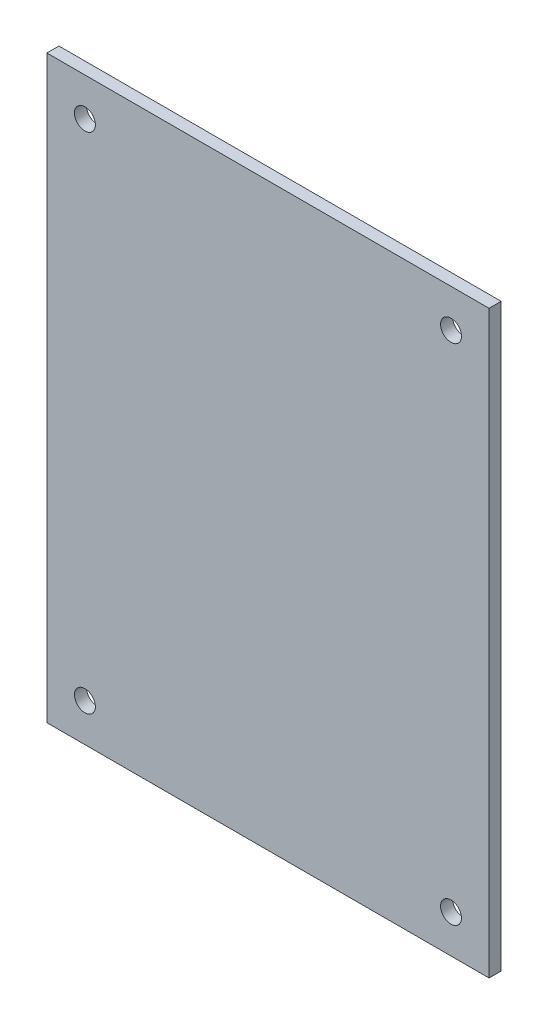
ISO-10303-21;
HEADER;
FILE_DESCRIPTION(('STEP AP214'),'2;1');
FILE_NAME('part.step','',(''),(''),'','','');
FILE_SCHEMA(('AUTOMOTIVE_DESIGN { 1 0 10303 214 1 1 1 1 }'));
ENDSEC;
DATA;
#1=APPLICATION_CONTEXT('core data for automotive mechanical design processes');
#2=APPLICATION_PROTOCOL_DEFINITION('international standard','automotive_design',2000,#1);
#3=PRODUCT_CONTEXT('',#1,'mechanical');
#4=PRODUCT('Part','Part','',(#3));
#5=PRODUCT_RELATED_PRODUCT_CATEGORY('part','',(#4));
#6=PRODUCT_DEFINITION_FORMATION('','',#4);
#7=PRODUCT_DEFINITION_CONTEXT('part definition',#1,'design');
#8=PRODUCT_DEFINITION('design','',#6,#7);
#9=PRODUCT_DEFINITION_SHAPE('','',#8);
#10=(LENGTH_UNIT() NAMED_UNIT(*) SI_UNIT(.MILLI.,.METRE.));
#11=(NAMED_UNIT(*) PLANE_ANGLE_UNIT() SI_UNIT($,.RADIAN.));
#12=(NAMED_UNIT(*) SI_UNIT($,.STERADIAN.) SOLID_ANGLE_UNIT());
#13=UNCERTAINTY_MEASURE_WITH_UNIT(LENGTH_MEASURE(1.E-05),#10,'distance_accuracy_value','');
#14=(GEOMETRIC_REPRESENTATION_CONTEXT(3) GLOBAL_UNCERTAINTY_ASSIGNED_CONTEXT((#13)) GLOBAL_UNIT_ASSIGNED_CONTEXT((#10,
#11,#12)) REPRESENTATION_CONTEXT('',''));
#15=CARTESIAN_POINT('',(0.,0.,0.));
#16=DIRECTION('',(0.,0.,1.));
#17=DIRECTION('',(1.,0.,0.));
#18=AXIS2_PLACEMENT_3D('',#15,#16,#17);
#19=CARTESIAN_POINT('',(0.,0.,3.175));
#20=DIRECTION('',(0.,1.,0.));
#21=DIRECTION('',(0.,0.,1.));
#22=AXIS2_PLACEMENT_3D('',#19,#20,#21);
#23=PLANE('',#22);
#24=DIRECTION('',(1.,0.,0.));
#25=VECTOR('',#24,1.);
#26=CARTESIAN_POINT('',(0.,0.,0.));
#27=LINE('',#26,#25);
#28=CARTESIAN_POINT('',(0.,0.,0.));
#29=VERTEX_POINT('',#28);
#30=CARTESIAN_POINT('',(116.20000001,0.,0.));
#31=VERTEX_POINT('',#30);
#32=EDGE_CURVE('E102',#29,#31,#27,.T.);
#33=ORIENTED_EDGE('',*,*,#32,.T.);
#34=DIRECTION('',(0.,0.,-1.));
#35=VECTOR('',#34,1.);
#36=CARTESIAN_POINT('',(116.20000001,0.,3.175));
#37=LINE('',#36,#35);
#38=CARTESIAN_POINT('',(116.20000001,0.,3.175));
#39=VERTEX_POINT('',#38);
#40=EDGE_CURVE('E11',#39,#31,#37,.T.);
#41=ORIENTED_EDGE('',*,*,#40,.F.);
#42=DIRECTION('',(1.,0.,0.));
#43=VECTOR('',#42,1.);
#44=CARTESIAN_POINT('',(0.,0.,3.175));
#45=LINE('',#44,#43);
#46=CARTESIAN_POINT('',(0.,0.,3.175));
#47=VERTEX_POINT('',#46);
#48=EDGE_CURVE('E88',#47,#39,#45,.T.);
#49=ORIENTED_EDGE('',*,*,#48,.F.);
#50=DIRECTION('',(0.,0.,-1.));
#51=VECTOR('',#50,1.);
#52=CARTESIAN_POINT('',(0.,0.,3.175));
#53=LINE('',#52,#51);
#54=EDGE_CURVE('E55',#47,#29,#53,.T.);
#55=ORIENTED_EDGE('',*,*,#54,.T.);
#56=EDGE_LOOP('',(#33,#41,#49,#55));
#57=FACE_BOUND('',#56,.T.);
#58=ADVANCED_FACE('F39',(#57),#23,.F.);
#59=CARTESIAN_POINT('',(116.20000001,0.,3.175));
#60=DIRECTION('',(-1.,0.,0.));
#61=DIRECTION('',(0.,0.,1.));
#62=AXIS2_PLACEMENT_3D('',#59,#60,#61);
#63=PLANE('',#62);
#64=DIRECTION('',(0.,1.,0.));
#65=VECTOR('',#64,1.);
#66=CARTESIAN_POINT('',(116.20000001,0.,0.));
#67=LINE('',#66,#65);
#68=CARTESIAN_POINT('',(116.20000001,152.4,0.));
#69=VERTEX_POINT('',#68);
#70=EDGE_CURVE('E93',#31,#69,#67,.T.);
#71=ORIENTED_EDGE('',*,*,#70,.T.);
#72=DIRECTION('',(0.,0.,-1.));
#73=VECTOR('',#72,1.);
#74=CARTESIAN_POINT('',(116.20000001,152.4,3.175));
#75=LINE('',#74,#73);
#76=CARTESIAN_POINT('',(116.20000001,152.4,3.175));
#77=VERTEX_POINT('',#76);
#78=EDGE_CURVE('E47',#77,#69,#75,.T.);
#79=ORIENTED_EDGE('',*,*,#78,.F.);
#80=DIRECTION('',(0.,1.,0.));
#81=VECTOR('',#80,1.);
#82=CARTESIAN_POINT('',(116.20000001,0.,3.175));
#83=LINE('',#82,#81);
#84=EDGE_CURVE('E80',#39,#77,#83,.T.);
#85=ORIENTED_EDGE('',*,*,#84,.F.);
#86=ORIENTED_EDGE('',*,*,#40,.T.);
#87=EDGE_LOOP('',(#71,#79,#85,#86));
#88=FACE_BOUND('',#87,.T.);
#89=ADVANCED_FACE('F92',(#88),#63,.F.);
#90=CARTESIAN_POINT('',(0.,152.4,3.175));
#91=DIRECTION('',(0.,1.,0.));
#92=DIRECTION('',(0.,0.,1.));
#93=AXIS2_PLACEMENT_3D('',#90,#91,#92);
#94=PLANE('',#93);
#95=DIRECTION('',(1.,0.,0.));
#96=VECTOR('',#95,1.);
#97=CARTESIAN_POINT('',(0.,152.4,0.));
#98=LINE('',#97,#96);
#99=CARTESIAN_POINT('',(0.,152.4,0.));
#100=VERTEX_POINT('',#99);
#101=EDGE_CURVE('E106',#100,#69,#98,.T.);
#102=ORIENTED_EDGE('',*,*,#101,.F.);
#103=DIRECTION('',(0.,0.,-1.));
#104=VECTOR('',#103,1.);
#105=CARTESIAN_POINT('',(0.,152.4,3.175));
#106=LINE('',#105,#104);
#107=CARTESIAN_POINT('',(0.,152.4,3.175));
#108=VERTEX_POINT('',#107);
#109=EDGE_CURVE('E69',#108,#100,#106,.T.);
#110=ORIENTED_EDGE('',*,*,#109,.F.);
#111=DIRECTION('',(1.,0.,0.));
#112=VECTOR('',#111,1.);
#113=CARTESIAN_POINT('',(0.,152.4,3.175));
#114=LINE('',#113,#112);
#115=EDGE_CURVE('E87',#108,#77,#114,.T.);
#116=ORIENTED_EDGE('',*,*,#115,.T.);
#117=ORIENTED_EDGE('',*,*,#78,.T.);
#118=EDGE_LOOP('',(#102,#110,#116,#117));
#119=FACE_BOUND('',#118,.T.);
#120=ADVANCED_FACE('F96',(#119),#94,.T.);
#121=CARTESIAN_POINT('',(0.,0.,3.175));
#122=DIRECTION('',(-1.,0.,0.));
#123=DIRECTION('',(0.,0.,1.));
#124=AXIS2_PLACEMENT_3D('',#121,#122,#123);
#125=PLANE('',#124);
#126=DIRECTION('',(0.,1.,0.));
#127=VECTOR('',#126,1.);
#128=CARTESIAN_POINT('',(0.,0.,0.));
#129=LINE('',#128,#127);
#130=EDGE_CURVE('E108',#29,#100,#129,.T.);
#131=ORIENTED_EDGE('',*,*,#130,.F.);
#132=ORIENTED_EDGE('',*,*,#54,.F.);
#133=DIRECTION('',(0.,1.,0.));
#134=VECTOR('',#133,1.);
#135=CARTESIAN_POINT('',(0.,0.,3.175));
#136=LINE('',#135,#134);
#137=EDGE_CURVE('E97',#47,#108,#136,.T.);
#138=ORIENTED_EDGE('',*,*,#137,.T.);
#139=ORIENTED_EDGE('',*,*,#109,.T.);
#140=EDGE_LOOP('',(#131,#132,#138,#139));
#141=FACE_BOUND('',#140,.T.);
#142=ADVANCED_FACE('F143',(#141),#125,.T.);
#143=CARTESIAN_POINT('',(0.,0.,3.175));
#144=DIRECTION('',(0.,0.,1.));
#145=DIRECTION('',(1.,0.,0.));
#146=AXIS2_PLACEMENT_3D('',#143,#144,#145);
#147=PLANE('',#146);
#148=CARTESIAN_POINT('',(10.,142.4,3.175));
#149=DIRECTION('',(0.,0.,1.));
#150=DIRECTION('',(1.,0.,0.));
#151=AXIS2_PLACEMENT_3D('',#148,#149,#150);
#152=CIRCLE('',#151,2.75);
#153=CARTESIAN_POINT('',(12.75,142.4,3.175));
#154=VERTEX_POINT('',#153);
#155=EDGE_CURVE('E134',#154,#154,#152,.T.);
#156=ORIENTED_EDGE('',*,*,#155,.F.);
#157=EDGE_LOOP('',(#156));
#158=FACE_BOUND('',#157,.T.);
#159=CARTESIAN_POINT('',(106.20000001,142.4,3.175));
#160=DIRECTION('',(0.,0.,1.));
#161=DIRECTION('',(1.,0.,0.));
#162=AXIS2_PLACEMENT_3D('',#159,#160,#161);
#163=CIRCLE('',#162,2.75);
#164=CARTESIAN_POINT('',(108.95000001,142.4,3.175));
#165=VERTEX_POINT('',#164);
#166=EDGE_CURVE('E128',#165,#165,#163,.T.);
#167=ORIENTED_EDGE('',*,*,#166,.F.);
#168=EDGE_LOOP('',(#167));
#169=FACE_BOUND('',#168,.T.);
#170=CARTESIAN_POINT('',(106.20000001,10.,3.175));
#171=DIRECTION('',(0.,0.,1.));
#172=DIRECTION('',(1.,0.,0.));
#173=AXIS2_PLACEMENT_3D('',#170,#171,#172);
#174=CIRCLE('',#173,2.75);
#175=CARTESIAN_POINT('',(108.95000001,10.,3.175));
#176=VERTEX_POINT('',#175);
#177=EDGE_CURVE('E122',#176,#176,#174,.T.);
#178=ORIENTED_EDGE('',*,*,#177,.F.);
#179=EDGE_LOOP('',(#178));
#180=FACE_BOUND('',#179,.T.);
#181=CARTESIAN_POINT('',(10.,10.,3.175));
#182=DIRECTION('',(0.,0.,1.));
#183=DIRECTION('',(1.,0.,0.));
#184=AXIS2_PLACEMENT_3D('',#181,#182,#183);
#185=CIRCLE('',#184,2.75);
#186=CARTESIAN_POINT('',(12.75,10.,3.175));
#187=VERTEX_POINT('',#186);
#188=EDGE_CURVE('E116',#187,#187,#185,.T.);
#189=ORIENTED_EDGE('',*,*,#188,.F.);
#190=EDGE_LOOP('',(#189));
#191=FACE_BOUND('',#190,.T.);
#192=ORIENTED_EDGE('',*,*,#48,.T.);
#193=ORIENTED_EDGE('',*,*,#84,.T.);
#194=ORIENTED_EDGE('',*,*,#115,.F.);
#195=ORIENTED_EDGE('',*,*,#137,.F.);
#196=EDGE_LOOP('',(#192,#193,#194,#195));
#197=FACE_BOUND('',#196,.T.);
#198=ADVANCED_FACE('F84',(#158,#169,#180,#191,#197),#147,.T.);
#199=CARTESIAN_POINT('',(0.,0.,0.));
#200=DIRECTION('',(0.,0.,1.));
#201=DIRECTION('',(1.,0.,0.));
#202=AXIS2_PLACEMENT_3D('',#199,#200,#201);
#203=PLANE('',#202);
#204=CARTESIAN_POINT('',(10.,142.4,0.));
#205=DIRECTION('',(0.,0.,1.));
#206=DIRECTION('',(1.,0.,0.));
#207=AXIS2_PLACEMENT_3D('',#204,#205,#206);
#208=CIRCLE('',#207,2.75);
#209=CARTESIAN_POINT('',(12.75,142.4,0.));
#210=VERTEX_POINT('',#209);
#211=EDGE_CURVE('E131',#210,#210,#208,.T.);
#212=ORIENTED_EDGE('',*,*,#211,.T.);
#213=EDGE_LOOP('',(#212));
#214=FACE_BOUND('',#213,.T.);
#215=CARTESIAN_POINT('',(106.20000001,142.4,0.));
#216=DIRECTION('',(0.,0.,1.));
#217=DIRECTION('',(1.,0.,0.));
#218=AXIS2_PLACEMENT_3D('',#215,#216,#217);
#219=CIRCLE('',#218,2.75);
#220=CARTESIAN_POINT('',(108.95000001,142.4,0.));
#221=VERTEX_POINT('',#220);
#222=EDGE_CURVE('E125',#221,#221,#219,.T.);
#223=ORIENTED_EDGE('',*,*,#222,.T.);
#224=EDGE_LOOP('',(#223));
#225=FACE_BOUND('',#224,.T.);
#226=CARTESIAN_POINT('',(106.20000001,10.,0.));
#227=DIRECTION('',(0.,0.,1.));
#228=DIRECTION('',(1.,0.,0.));
#229=AXIS2_PLACEMENT_3D('',#226,#227,#228);
#230=CIRCLE('',#229,2.75);
#231=CARTESIAN_POINT('',(108.95000001,10.,0.));
#232=VERTEX_POINT('',#231);
#233=EDGE_CURVE('E119',#232,#232,#230,.T.);
#234=ORIENTED_EDGE('',*,*,#233,.T.);
#235=EDGE_LOOP('',(#234));
#236=FACE_BOUND('',#235,.T.);
#237=CARTESIAN_POINT('',(10.,10.,0.));
#238=DIRECTION('',(0.,0.,1.));
#239=DIRECTION('',(1.,0.,0.));
#240=AXIS2_PLACEMENT_3D('',#237,#238,#239);
#241=CIRCLE('',#240,2.75);
#242=CARTESIAN_POINT('',(12.75,10.,0.));
#243=VERTEX_POINT('',#242);
#244=EDGE_CURVE('E104',#243,#243,#241,.T.);
#245=ORIENTED_EDGE('',*,*,#244,.T.);
#246=EDGE_LOOP('',(#245));
#247=FACE_BOUND('',#246,.T.);
#248=ORIENTED_EDGE('',*,*,#32,.F.);
#249=ORIENTED_EDGE('',*,*,#130,.T.);
#250=ORIENTED_EDGE('',*,*,#101,.T.);
#251=ORIENTED_EDGE('',*,*,#70,.F.);
#252=EDGE_LOOP('',(#248,#249,#250,#251));
#253=FACE_BOUND('',#252,.T.);
#254=ADVANCED_FACE('F142',(#214,#225,#236,#247,#253),#203,.F.);
#255=CARTESIAN_POINT('',(10.,10.,3.175));
#256=DIRECTION('',(0.,0.,1.));
#257=DIRECTION('',(1.,0.,0.));
#258=AXIS2_PLACEMENT_3D('',#255,#256,#257);
#259=CYLINDRICAL_SURFACE('',#258,2.75);
#260=ORIENTED_EDGE('',*,*,#244,.F.);
#261=EDGE_LOOP('',(#260));
#262=FACE_BOUND('',#261,.T.);
#263=ORIENTED_EDGE('',*,*,#188,.T.);
#264=EDGE_LOOP('',(#263));
#265=FACE_BOUND('',#264,.T.);
#266=ADVANCED_FACE('F151',(#262,#265),#259,.F.);
#267=CARTESIAN_POINT('',(106.20000001,10.,3.175));
#268=DIRECTION('',(0.,0.,1.));
#269=DIRECTION('',(1.,0.,0.));
#270=AXIS2_PLACEMENT_3D('',#267,#268,#269);
#271=CYLINDRICAL_SURFACE('',#270,2.75);
#272=ORIENTED_EDGE('',*,*,#233,.F.);
#273=EDGE_LOOP('',(#272));
#274=FACE_BOUND('',#273,.T.);
#275=ORIENTED_EDGE('',*,*,#177,.T.);
#276=EDGE_LOOP('',(#275));
#277=FACE_BOUND('',#276,.T.);
#278=ADVANCED_FACE('F153',(#274,#277),#271,.F.);
#279=CARTESIAN_POINT('',(106.20000001,142.4,3.175));
#280=DIRECTION('',(0.,0.,1.));
#281=DIRECTION('',(1.,0.,0.));
#282=AXIS2_PLACEMENT_3D('',#279,#280,#281);
#283=CYLINDRICAL_SURFACE('',#282,2.75);
#284=ORIENTED_EDGE('',*,*,#222,.F.);
#285=EDGE_LOOP('',(#284));
#286=FACE_BOUND('',#285,.T.);
#287=ORIENTED_EDGE('',*,*,#166,.T.);
#288=EDGE_LOOP('',(#287));
#289=FACE_BOUND('',#288,.T.);
#290=ADVANCED_FACE('F160',(#286,#289),#283,.F.);
#291=CARTESIAN_POINT('',(10.,142.4,3.175));
#292=DIRECTION('',(0.,0.,1.));
#293=DIRECTION('',(1.,0.,0.));
#294=AXIS2_PLACEMENT_3D('',#291,#292,#293);
#295=CYLINDRICAL_SURFACE('',#294,2.75);
#296=ORIENTED_EDGE('',*,*,#211,.F.);
#297=EDGE_LOOP('',(#296));
#298=FACE_BOUND('',#297,.T.);
#299=ORIENTED_EDGE('',*,*,#155,.T.);
#300=EDGE_LOOP('',(#299));
#301=FACE_BOUND('',#300,.T.);
#302=ADVANCED_FACE('F138',(#298,#301),#295,.F.);
#303=CLOSED_SHELL('',(#58,#89,#120,#142,#198,#254,#266,#278,#290,#302));
#304=MANIFOLD_SOLID_BREP('B2',#303);
#305=ADVANCED_BREP_SHAPE_REPRESENTATION('',(#18,#304),#14);
#306=SHAPE_DEFINITION_REPRESENTATION(#9,#305);
ENDSEC;
END-ISO-10303-21;
